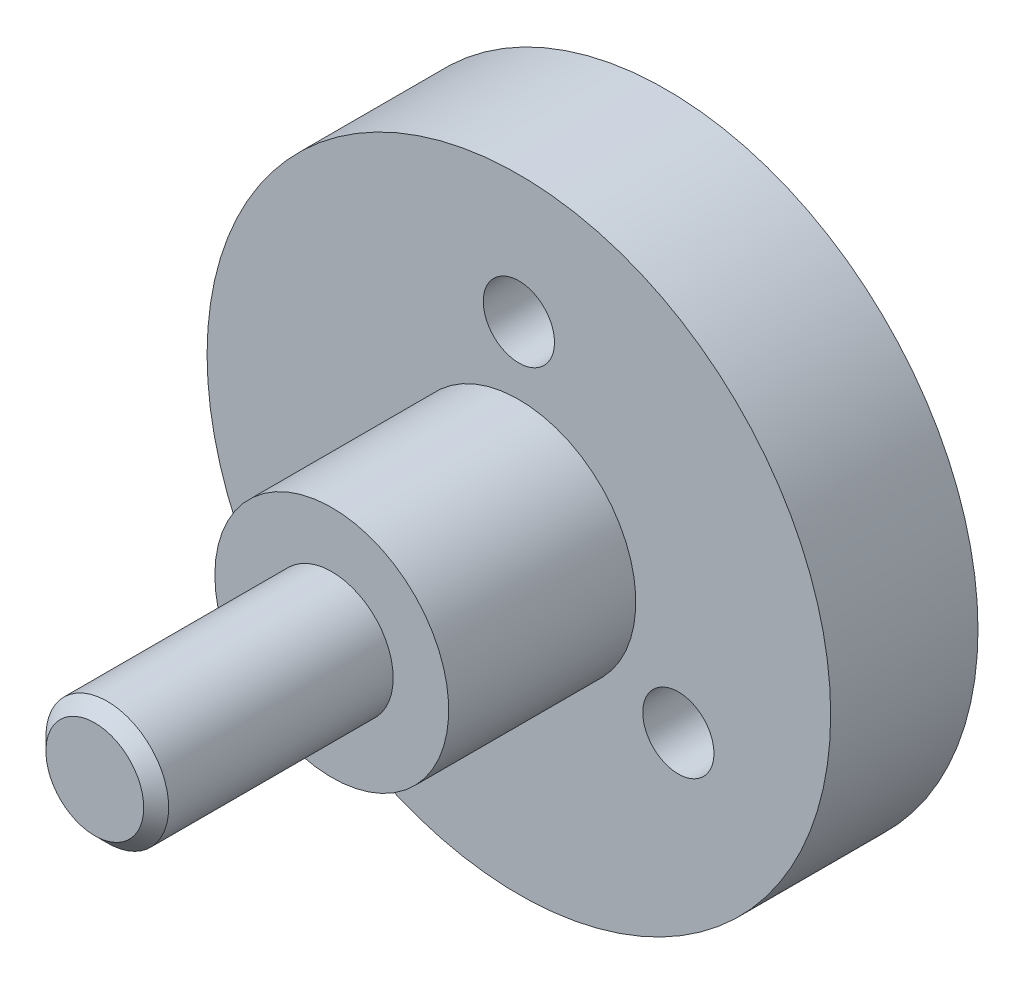
ISO-10303-21;
HEADER;
FILE_DESCRIPTION(('STEP AP214'),'2;1');
FILE_NAME('part.step','',(''),(''),'','','');
FILE_SCHEMA(('AUTOMOTIVE_DESIGN { 1 0 10303 214 1 1 1 1 }'));
ENDSEC;
DATA;
#1=APPLICATION_CONTEXT('core data for automotive mechanical design processes');
#2=APPLICATION_PROTOCOL_DEFINITION('international standard','automotive_design',2000,#1);
#3=PRODUCT_CONTEXT('',#1,'mechanical');
#4=PRODUCT('Part','Part','',(#3));
#5=PRODUCT_RELATED_PRODUCT_CATEGORY('part','',(#4));
#6=PRODUCT_DEFINITION_FORMATION('','',#4);
#7=PRODUCT_DEFINITION_CONTEXT('part definition',#1,'design');
#8=PRODUCT_DEFINITION('design','',#6,#7);
#9=PRODUCT_DEFINITION_SHAPE('','',#8);
#10=(LENGTH_UNIT() NAMED_UNIT(*) SI_UNIT(.MILLI.,.METRE.));
#11=(NAMED_UNIT(*) PLANE_ANGLE_UNIT() SI_UNIT($,.RADIAN.));
#12=(NAMED_UNIT(*) SI_UNIT($,.STERADIAN.) SOLID_ANGLE_UNIT());
#13=UNCERTAINTY_MEASURE_WITH_UNIT(LENGTH_MEASURE(1.E-05),#10,'distance_accuracy_value','');
#14=(GEOMETRIC_REPRESENTATION_CONTEXT(3) GLOBAL_UNCERTAINTY_ASSIGNED_CONTEXT((#13)) GLOBAL_UNIT_ASSIGNED_CONTEXT((#10,
#11,#12)) REPRESENTATION_CONTEXT('',''));
#15=CARTESIAN_POINT('',(0.,0.,0.));
#16=DIRECTION('',(0.,0.,1.));
#17=DIRECTION('',(1.,0.,0.));
#18=AXIS2_PLACEMENT_3D('',#15,#16,#17);
#19=CARTESIAN_POINT('',(0.,0.,2.54));
#20=DIRECTION('',(0.,0.,-1.));
#21=DIRECTION('',(-1.,0.,0.));
#22=AXIS2_PLACEMENT_3D('',#19,#20,#21);
#23=CYLINDRICAL_SURFACE('',#22,6.35);
#24=CARTESIAN_POINT('',(0.,0.,2.54));
#25=DIRECTION('',(0.,0.,-1.));
#26=DIRECTION('',(-1.,0.,0.));
#27=AXIS2_PLACEMENT_3D('',#24,#25,#26);
#28=CIRCLE('',#27,6.35);
#29=CARTESIAN_POINT('',(-5.859720286426,-2.44666674576814,2.54));
#30=VERTEX_POINT('',#29);
#31=CARTESIAN_POINT('',(-0.810984586783252,6.298,2.54));
#32=VERTEX_POINT('',#31);
#33=EDGE_CURVE('E100',#30,#32,#28,.T.);
#34=ORIENTED_EDGE('',*,*,#33,.F.);
#35=DIRECTION('',(0.,0.,1.));
#36=VECTOR('',#35,1.);
#37=CARTESIAN_POINT('',(-5.859720286426,-2.44666674576814,3.));
#38=LINE('',#37,#36);
#39=CARTESIAN_POINT('',(-5.859720286426,-2.44666674576814,0.));
#40=VERTEX_POINT('',#39);
#41=EDGE_CURVE('E49',#30,#40,#38,.F.);
#42=ORIENTED_EDGE('',*,*,#41,.T.);
#43=CARTESIAN_POINT('',(0.,0.,0.));
#44=DIRECTION('',(0.,0.,-1.));
#45=DIRECTION('',(-1.,0.,0.));
#46=AXIS2_PLACEMENT_3D('',#43,#44,#45);
#47=CIRCLE('',#46,6.35);
#48=CARTESIAN_POINT('',(-0.810984586783251,6.298,0.));
#49=VERTEX_POINT('',#48);
#50=EDGE_CURVE('E98',#40,#49,#47,.T.);
#51=ORIENTED_EDGE('',*,*,#50,.T.);
#52=DIRECTION('',(0.,0.,1.));
#53=VECTOR('',#52,1.);
#54=CARTESIAN_POINT('',(-0.810984586783251,6.298,3.));
#55=LINE('',#54,#53);
#56=EDGE_CURVE('E113',#49,#32,#55,.T.);
#57=ORIENTED_EDGE('',*,*,#56,.T.);
#58=EDGE_LOOP('',(#34,#42,#51,#57));
#59=FACE_BOUND('',#58,.T.);
#60=ADVANCED_FACE('F33',(#59),#23,.F.);
#61=CARTESIAN_POINT('',(5.04873569964323,-3.85133325423132,0.));
#62=VERTEX_POINT('',#61);
#63=CARTESIAN_POINT('',(-5.04873569964231,-3.85133325423252,0.));
#64=VERTEX_POINT('',#63);
#65=EDGE_CURVE('E108',#62,#64,#47,.T.);
#66=ORIENTED_EDGE('',*,*,#65,.T.);
#67=DIRECTION('',(0.,0.,1.));
#68=VECTOR('',#67,1.);
#69=CARTESIAN_POINT('',(-5.04873569964231,-3.85133325423252,3.));
#70=LINE('',#69,#68);
#71=CARTESIAN_POINT('',(-5.04873569964231,-3.85133325423252,2.54));
#72=VERTEX_POINT('',#71);
#73=EDGE_CURVE('E88',#64,#72,#70,.T.);
#74=ORIENTED_EDGE('',*,*,#73,.T.);
#75=CARTESIAN_POINT('',(5.04873569964322,-3.85133325423132,2.54));
#76=VERTEX_POINT('',#75);
#77=EDGE_CURVE('E120',#76,#72,#28,.T.);
#78=ORIENTED_EDGE('',*,*,#77,.F.);
#79=DIRECTION('',(0.,0.,1.));
#80=VECTOR('',#79,1.);
#81=CARTESIAN_POINT('',(5.04873569964323,-3.85133325423132,3.));
#82=LINE('',#81,#80);
#83=EDGE_CURVE('E57',#76,#62,#82,.F.);
#84=ORIENTED_EDGE('',*,*,#83,.T.);
#85=EDGE_LOOP('',(#66,#74,#78,#84));
#86=FACE_BOUND('',#85,.T.);
#87=ADVANCED_FACE('F160',(#86),#23,.F.);
#88=CARTESIAN_POINT('',(0.,0.,6.));
#89=DIRECTION('',(0.,0.,-1.));
#90=DIRECTION('',(-1.,0.,0.));
#91=AXIS2_PLACEMENT_3D('',#88,#89,#90);
#92=CYLINDRICAL_SURFACE('',#91,12.7);
#93=CARTESIAN_POINT('',(0.,0.,6.));
#94=DIRECTION('',(0.,0.,1.));
#95=DIRECTION('',(1.,0.,0.));
#96=AXIS2_PLACEMENT_3D('',#93,#94,#95);
#97=CIRCLE('',#96,12.7);
#98=CARTESIAN_POINT('',(12.7,0.,6.));
#99=VERTEX_POINT('',#98);
#100=EDGE_CURVE('E130',#99,#99,#97,.T.);
#101=ORIENTED_EDGE('',*,*,#100,.F.);
#102=EDGE_LOOP('',(#101));
#103=FACE_BOUND('',#102,.T.);
#104=CARTESIAN_POINT('',(0.,0.,0.));
#105=DIRECTION('',(0.,0.,1.));
#106=DIRECTION('',(1.,0.,0.));
#107=AXIS2_PLACEMENT_3D('',#104,#105,#106);
#108=CIRCLE('',#107,12.7);
#109=CARTESIAN_POINT('',(12.7,0.,0.));
#110=VERTEX_POINT('',#109);
#111=EDGE_CURVE('E127',#110,#110,#108,.T.);
#112=ORIENTED_EDGE('',*,*,#111,.T.);
#113=EDGE_LOOP('',(#112));
#114=FACE_BOUND('',#113,.T.);
#115=ADVANCED_FACE('F166',(#103,#114),#92,.T.);
#116=CARTESIAN_POINT('',(0.,0.,6.));
#117=DIRECTION('',(0.,0.,1.));
#118=DIRECTION('',(1.,0.,0.));
#119=AXIS2_PLACEMENT_3D('',#116,#117,#118);
#120=PLANE('',#119);
#121=CARTESIAN_POINT('',(0.,0.,6.));
#122=DIRECTION('',(0.,0.,1.));
#123=DIRECTION('',(1.,0.,0.));
#124=AXIS2_PLACEMENT_3D('',#121,#122,#123);
#125=CIRCLE('',#124,4.7625);
#126=CARTESIAN_POINT('',(-4.7625,0.,6.));
#127=VERTEX_POINT('',#126);
#128=EDGE_CURVE('E303',#127,#127,#125,.T.);
#129=ORIENTED_EDGE('',*,*,#128,.F.);
#130=EDGE_LOOP('',(#129));
#131=FACE_BOUND('',#130,.T.);
#132=CARTESIAN_POINT('',(-6.49519052838281,-3.75000000000028,6.));
#133=DIRECTION('',(0.,0.,1.));
#134=DIRECTION('',(1.,0.,0.));
#135=AXIS2_PLACEMENT_3D('',#132,#133,#134);
#136=CIRCLE('',#135,1.45);
#137=CARTESIAN_POINT('',(-5.04519052838281,-3.75000000000028,6.));
#138=VERTEX_POINT('',#137);
#139=EDGE_CURVE('E93',#138,#138,#136,.T.);
#140=ORIENTED_EDGE('',*,*,#139,.F.);
#141=EDGE_LOOP('',(#140));
#142=FACE_BOUND('',#141,.T.);
#143=CARTESIAN_POINT('',(6.49519052838377,-3.74999999999972,6.));
#144=DIRECTION('',(0.,0.,1.));
#145=DIRECTION('',(1.,0.,0.));
#146=AXIS2_PLACEMENT_3D('',#143,#144,#145);
#147=CIRCLE('',#146,1.45);
#148=CARTESIAN_POINT('',(7.94519052838377,-3.74999999999972,6.));
#149=VERTEX_POINT('',#148);
#150=EDGE_CURVE('E101',#149,#149,#147,.T.);
#151=ORIENTED_EDGE('',*,*,#150,.F.);
#152=EDGE_LOOP('',(#151));
#153=FACE_BOUND('',#152,.T.);
#154=CARTESIAN_POINT('',(0.,7.5,6.));
#155=DIRECTION('',(0.,0.,1.));
#156=DIRECTION('',(1.,0.,0.));
#157=AXIS2_PLACEMENT_3D('',#154,#155,#156);
#158=CIRCLE('',#157,1.45);
#159=CARTESIAN_POINT('',(1.45,7.5,6.));
#160=VERTEX_POINT('',#159);
#161=EDGE_CURVE('E287',#160,#160,#158,.T.);
#162=ORIENTED_EDGE('',*,*,#161,.F.);
#163=EDGE_LOOP('',(#162));
#164=FACE_BOUND('',#163,.T.);
#165=ORIENTED_EDGE('',*,*,#100,.T.);
#166=EDGE_LOOP('',(#165));
#167=FACE_BOUND('',#166,.T.);
#168=ADVANCED_FACE('F177',(#131,#142,#153,#164,#167),#120,.T.);
#169=CARTESIAN_POINT('',(0.,0.,0.));
#170=DIRECTION('',(0.,0.,1.));
#171=DIRECTION('',(1.,0.,0.));
#172=AXIS2_PLACEMENT_3D('',#169,#170,#171);
#173=PLANE('',#172);
#174=ORIENTED_EDGE('',*,*,#50,.F.);
#175=CARTESIAN_POINT('',(-6.49519052838281,-3.75000000000028,0.));
#176=DIRECTION('',(0.,0.,1.));
#177=DIRECTION('',(1.,0.,0.));
#178=AXIS2_PLACEMENT_3D('',#175,#176,#177);
#179=CIRCLE('',#178,1.45);
#180=EDGE_CURVE('E85',#40,#64,#179,.T.);
#181=ORIENTED_EDGE('',*,*,#180,.T.);
#182=ORIENTED_EDGE('',*,*,#65,.F.);
#183=CARTESIAN_POINT('',(6.49519052838377,-3.74999999999972,0.));
#184=DIRECTION('',(0.,0.,1.));
#185=DIRECTION('',(1.,0.,0.));
#186=AXIS2_PLACEMENT_3D('',#183,#184,#185);
#187=CIRCLE('',#186,1.45);
#188=CARTESIAN_POINT('',(5.85972028642604,-2.44666674576802,0.));
#189=VERTEX_POINT('',#188);
#190=EDGE_CURVE('E295',#62,#189,#187,.T.);
#191=ORIENTED_EDGE('',*,*,#190,.T.);
#192=CARTESIAN_POINT('',(0.810984586783251,6.298,0.));
#193=VERTEX_POINT('',#192);
#194=EDGE_CURVE('E111',#193,#189,#47,.T.);
#195=ORIENTED_EDGE('',*,*,#194,.F.);
#196=CARTESIAN_POINT('',(0.,7.5,0.));
#197=DIRECTION('',(0.,0.,1.));
#198=DIRECTION('',(1.,0.,0.));
#199=AXIS2_PLACEMENT_3D('',#196,#197,#198);
#200=CIRCLE('',#199,1.45);
#201=EDGE_CURVE('E107',#193,#49,#200,.T.);
#202=ORIENTED_EDGE('',*,*,#201,.T.);
#203=EDGE_LOOP('',(#174,#181,#182,#191,#195,#202));
#204=FACE_BOUND('',#203,.T.);
#205=ORIENTED_EDGE('',*,*,#111,.F.);
#206=EDGE_LOOP('',(#205));
#207=FACE_BOUND('',#206,.T.);
#208=ADVANCED_FACE('F104',(#204,#207),#173,.F.);
#209=ORIENTED_EDGE('',*,*,#194,.T.);
#210=DIRECTION('',(0.,0.,1.));
#211=VECTOR('',#210,1.);
#212=CARTESIAN_POINT('',(5.85972028642604,-2.44666674576802,3.));
#213=LINE('',#212,#211);
#214=CARTESIAN_POINT('',(5.85972028642604,-2.44666674576802,2.54));
#215=VERTEX_POINT('',#214);
#216=EDGE_CURVE('E293',#189,#215,#213,.T.);
#217=ORIENTED_EDGE('',*,*,#216,.T.);
#218=CARTESIAN_POINT('',(0.810984586783252,6.298,2.54));
#219=VERTEX_POINT('',#218);
#220=EDGE_CURVE('E121',#219,#215,#28,.T.);
#221=ORIENTED_EDGE('',*,*,#220,.F.);
#222=DIRECTION('',(0.,0.,1.));
#223=VECTOR('',#222,1.);
#224=CARTESIAN_POINT('',(0.810984586783251,6.298,3.));
#225=LINE('',#224,#223);
#226=EDGE_CURVE('E109',#219,#193,#225,.F.);
#227=ORIENTED_EDGE('',*,*,#226,.T.);
#228=EDGE_LOOP('',(#209,#217,#221,#227));
#229=FACE_BOUND('',#228,.T.);
#230=ADVANCED_FACE('F162',(#229),#23,.F.);
#231=CARTESIAN_POINT('',(0.,0.,2.54));
#232=DIRECTION('',(0.,0.,-1.));
#233=DIRECTION('',(-1.,0.,0.));
#234=AXIS2_PLACEMENT_3D('',#231,#232,#233);
#235=PLANE('',#234);
#236=CARTESIAN_POINT('',(-6.49519052838281,-3.75000000000028,2.54));
#237=DIRECTION('',(0.,0.,-1.));
#238=DIRECTION('',(-1.,0.,0.));
#239=AXIS2_PLACEMENT_3D('',#236,#237,#238);
#240=CIRCLE('',#239,1.45);
#241=EDGE_CURVE('E140',#30,#72,#240,.T.);
#242=ORIENTED_EDGE('',*,*,#241,.F.);
#243=ORIENTED_EDGE('',*,*,#33,.T.);
#244=CARTESIAN_POINT('',(0.,7.5,2.54));
#245=DIRECTION('',(0.,0.,-1.));
#246=DIRECTION('',(-1.,0.,0.));
#247=AXIS2_PLACEMENT_3D('',#244,#245,#246);
#248=CIRCLE('',#247,1.45);
#249=EDGE_CURVE('E135',#219,#32,#248,.T.);
#250=ORIENTED_EDGE('',*,*,#249,.F.);
#251=ORIENTED_EDGE('',*,*,#220,.T.);
#252=CARTESIAN_POINT('',(6.49519052838377,-3.74999999999972,2.54));
#253=DIRECTION('',(0.,0.,-1.));
#254=DIRECTION('',(-1.,0.,0.));
#255=AXIS2_PLACEMENT_3D('',#252,#253,#254);
#256=CIRCLE('',#255,1.45);
#257=EDGE_CURVE('E138',#76,#215,#256,.T.);
#258=ORIENTED_EDGE('',*,*,#257,.F.);
#259=ORIENTED_EDGE('',*,*,#77,.T.);
#260=EDGE_LOOP('',(#242,#243,#250,#251,#258,#259));
#261=FACE_BOUND('',#260,.T.);
#262=ADVANCED_FACE('F171',(#261),#235,.T.);
#263=CARTESIAN_POINT('',(0.,7.5,0.));
#264=DIRECTION('',(0.,0.,1.));
#265=DIRECTION('',(1.,0.,0.));
#266=AXIS2_PLACEMENT_3D('',#263,#264,#265);
#267=CYLINDRICAL_SURFACE('',#266,1.45);
#268=ORIENTED_EDGE('',*,*,#161,.T.);
#269=EDGE_LOOP('',(#268));
#270=FACE_BOUND('',#269,.T.);
#271=ORIENTED_EDGE('',*,*,#249,.T.);
#272=ORIENTED_EDGE('',*,*,#56,.F.);
#273=ORIENTED_EDGE('',*,*,#201,.F.);
#274=ORIENTED_EDGE('',*,*,#226,.F.);
#275=EDGE_LOOP('',(#271,#272,#273,#274));
#276=FACE_BOUND('',#275,.T.);
#277=ADVANCED_FACE('F176',(#270,#276),#267,.F.);
#278=CARTESIAN_POINT('',(6.49519052838377,-3.74999999999972,0.));
#279=DIRECTION('',(0.,0.,1.));
#280=DIRECTION('',(1.,0.,0.));
#281=AXIS2_PLACEMENT_3D('',#278,#279,#280);
#282=CYLINDRICAL_SURFACE('',#281,1.45);
#283=ORIENTED_EDGE('',*,*,#150,.T.);
#284=EDGE_LOOP('',(#283));
#285=FACE_BOUND('',#284,.T.);
#286=ORIENTED_EDGE('',*,*,#257,.T.);
#287=ORIENTED_EDGE('',*,*,#216,.F.);
#288=ORIENTED_EDGE('',*,*,#190,.F.);
#289=ORIENTED_EDGE('',*,*,#83,.F.);
#290=EDGE_LOOP('',(#286,#287,#288,#289));
#291=FACE_BOUND('',#290,.T.);
#292=ADVANCED_FACE('F243',(#285,#291),#282,.F.);
#293=CARTESIAN_POINT('',(-6.49519052838281,-3.75000000000028,0.));
#294=DIRECTION('',(0.,0.,1.));
#295=DIRECTION('',(1.,0.,0.));
#296=AXIS2_PLACEMENT_3D('',#293,#294,#295);
#297=CYLINDRICAL_SURFACE('',#296,1.45);
#298=ORIENTED_EDGE('',*,*,#139,.T.);
#299=EDGE_LOOP('',(#298));
#300=FACE_BOUND('',#299,.T.);
#301=ORIENTED_EDGE('',*,*,#241,.T.);
#302=ORIENTED_EDGE('',*,*,#73,.F.);
#303=ORIENTED_EDGE('',*,*,#180,.F.);
#304=ORIENTED_EDGE('',*,*,#41,.F.);
#305=EDGE_LOOP('',(#301,#302,#303,#304));
#306=FACE_BOUND('',#305,.T.);
#307=ADVANCED_FACE('F86',(#300,#306),#297,.F.);
#308=CARTESIAN_POINT('',(0.,0.,13.62));
#309=DIRECTION('',(0.,0.,-1.));
#310=DIRECTION('',(-1.,0.,0.));
#311=AXIS2_PLACEMENT_3D('',#308,#309,#310);
#312=CYLINDRICAL_SURFACE('',#311,4.7625);
#313=CARTESIAN_POINT('',(0.,0.,13.62));
#314=DIRECTION('',(0.,0.,1.));
#315=DIRECTION('',(1.,0.,0.));
#316=AXIS2_PLACEMENT_3D('',#313,#314,#315);
#317=CIRCLE('',#316,4.7625);
#318=CARTESIAN_POINT('',(-4.7625,0.,13.62));
#319=VERTEX_POINT('',#318);
#320=EDGE_CURVE('E306',#319,#319,#317,.T.);
#321=CARTESIAN_POINT('',(-4.7625,0.,13.62));
#322=CARTESIAN_POINT('',(-4.7625,0.,13.540625));
#323=CARTESIAN_POINT('',(-4.7625,0.,13.46125));
#324=CARTESIAN_POINT('',(-4.7625,0.,13.3025));
#325=CARTESIAN_POINT('',(-4.7625,0.,13.223125));
#326=CARTESIAN_POINT('',(-4.7625,0.,13.064375));
#327=CARTESIAN_POINT('',(-4.7625,0.,12.985));
#328=CARTESIAN_POINT('',(-4.7625,0.,12.82625));
#329=CARTESIAN_POINT('',(-4.7625,0.,12.746875));
#330=CARTESIAN_POINT('',(-4.7625,0.,12.588125));
#331=CARTESIAN_POINT('',(-4.7625,0.,12.50875));
#332=CARTESIAN_POINT('',(-4.7625,0.,12.35));
#333=CARTESIAN_POINT('',(-4.7625,0.,12.270625));
#334=CARTESIAN_POINT('',(-4.7625,0.,12.111875));
#335=CARTESIAN_POINT('',(-4.7625,0.,12.0325));
#336=CARTESIAN_POINT('',(-4.7625,0.,11.87375));
#337=CARTESIAN_POINT('',(-4.7625,0.,11.794375));
#338=CARTESIAN_POINT('',(-4.7625,0.,11.635625));
#339=CARTESIAN_POINT('',(-4.7625,0.,11.55625));
#340=CARTESIAN_POINT('',(-4.7625,0.,11.3975));
#341=CARTESIAN_POINT('',(-4.7625,0.,11.318125));
#342=CARTESIAN_POINT('',(-4.7625,0.,11.159375));
#343=CARTESIAN_POINT('',(-4.7625,0.,11.08));
#344=CARTESIAN_POINT('',(-4.7625,0.,10.92125));
#345=CARTESIAN_POINT('',(-4.7625,0.,10.841875));
#346=CARTESIAN_POINT('',(-4.7625,0.,10.683125));
#347=CARTESIAN_POINT('',(-4.7625,0.,10.60375));
#348=CARTESIAN_POINT('',(-4.7625,0.,10.445));
#349=CARTESIAN_POINT('',(-4.7625,0.,10.365625));
#350=CARTESIAN_POINT('',(-4.7625,0.,10.206875));
#351=CARTESIAN_POINT('',(-4.7625,0.,10.1275));
#352=CARTESIAN_POINT('',(-4.7625,0.,9.96875));
#353=CARTESIAN_POINT('',(-4.7625,0.,9.889375));
#354=CARTESIAN_POINT('',(-4.7625,0.,9.730625));
#355=CARTESIAN_POINT('',(-4.7625,0.,9.65125));
#356=CARTESIAN_POINT('',(-4.7625,0.,9.4925));
#357=CARTESIAN_POINT('',(-4.7625,0.,9.413125));
#358=CARTESIAN_POINT('',(-4.7625,0.,9.254375));
#359=CARTESIAN_POINT('',(-4.7625,0.,9.175));
#360=CARTESIAN_POINT('',(-4.7625,0.,9.01625));
#361=CARTESIAN_POINT('',(-4.7625,0.,8.936875));
#362=CARTESIAN_POINT('',(-4.7625,0.,8.778125));
#363=CARTESIAN_POINT('',(-4.7625,0.,8.69875));
#364=CARTESIAN_POINT('',(-4.7625,0.,8.54));
#365=CARTESIAN_POINT('',(-4.7625,0.,8.460625));
#366=CARTESIAN_POINT('',(-4.7625,0.,8.301875));
#367=CARTESIAN_POINT('',(-4.7625,0.,8.2225));
#368=CARTESIAN_POINT('',(-4.7625,0.,8.06375));
#369=CARTESIAN_POINT('',(-4.7625,0.,7.984375));
#370=CARTESIAN_POINT('',(-4.7625,0.,7.825625));
#371=CARTESIAN_POINT('',(-4.7625,0.,7.74625));
#372=CARTESIAN_POINT('',(-4.7625,0.,7.5875));
#373=CARTESIAN_POINT('',(-4.7625,0.,7.508125));
#374=CARTESIAN_POINT('',(-4.7625,0.,7.349375));
#375=CARTESIAN_POINT('',(-4.7625,0.,7.27));
#376=CARTESIAN_POINT('',(-4.7625,0.,7.11125));
#377=CARTESIAN_POINT('',(-4.7625,0.,7.031875));
#378=CARTESIAN_POINT('',(-4.7625,0.,6.873125));
#379=CARTESIAN_POINT('',(-4.7625,0.,6.79375));
#380=CARTESIAN_POINT('',(-4.7625,0.,6.635));
#381=CARTESIAN_POINT('',(-4.7625,0.,6.555625));
#382=CARTESIAN_POINT('',(-4.7625,0.,6.396875));
#383=CARTESIAN_POINT('',(-4.7625,0.,6.3175));
#384=CARTESIAN_POINT('',(-4.7625,0.,6.15875));
#385=CARTESIAN_POINT('',(-4.7625,0.,6.079375));
#386=CARTESIAN_POINT('',(-4.7625,0.,6.));
#387=B_SPLINE_CURVE_WITH_KNOTS('',3,(#321,#322,#323,#324,#325,#326,#327,#328,#329,#330,#331,
#332,#333,#334,#335,#336,#337,#338,#339,#340,#341,#342,#343,#344,#345,#346,#347,#348,#349,#350,
#351,#352,#353,#354,#355,#356,#357,#358,#359,#360,#361,#362,#363,#364,#365,#366,#367,#368,#369,
#370,#371,#372,#373,#374,#375,#376,#377,#378,#379,#380,#381,#382,#383,#384,#385,#386),
.UNSPECIFIED.,.F.,.F.,(4,2,2,2,2,2,2,2,2,2,2,2,2,2,2,2,2,2,2,2,2,2,2,2,2,2,2,2,2,2,2,2,4),(0.,
0.238124999999999,0.476249999999999,0.714375,0.952499999999998,1.190625,1.42875,1.666875,1.905,
2.143125,2.38125,2.619375,2.8575,3.095625,3.33375,3.571875,3.81,4.048125,4.28625,4.524375,
4.7625,5.000625,5.23875,5.476875,5.715,5.953125,6.19125,6.429375,6.6675,6.905625,7.14375,
7.381875,7.62),.UNSPECIFIED.);
#388=EDGE_CURVE('BSEAM204',#319,#127,#387,.T.);
#389=ORIENTED_EDGE('',*,*,#320,.F.);
#390=ORIENTED_EDGE('',*,*,#128,.T.);
#391=ORIENTED_EDGE('',*,*,#388,.T.);
#392=ORIENTED_EDGE('',*,*,#388,.F.);
#393=EDGE_LOOP('',(#389,#391,#390,#392));
#394=FACE_BOUND('',#393,.T.);
#395=ADVANCED_FACE('F204',(#394),#312,.T.);
#396=CARTESIAN_POINT('',(0.,0.,13.62));
#397=DIRECTION('',(0.,0.,1.));
#398=DIRECTION('',(1.,0.,0.));
#399=AXIS2_PLACEMENT_3D('',#396,#397,#398);
#400=PLANE('',#399);
#401=CARTESIAN_POINT('',(0.,0.,13.62));
#402=DIRECTION('',(0.,0.,1.));
#403=DIRECTION('',(1.,0.,0.));
#404=AXIS2_PLACEMENT_3D('',#401,#402,#403);
#405=CIRCLE('',#404,2.5);
#406=CARTESIAN_POINT('',(2.5,0.,13.62));
#407=VERTEX_POINT('',#406);
#408=EDGE_CURVE('E37',#407,#407,#405,.T.);
#409=ORIENTED_EDGE('',*,*,#408,.F.);
#410=EDGE_LOOP('',(#409));
#411=FACE_BOUND('',#410,.T.);
#412=ORIENTED_EDGE('',*,*,#320,.T.);
#413=EDGE_LOOP('',(#412));
#414=FACE_BOUND('',#413,.T.);
#415=ADVANCED_FACE('F156',(#411,#414),#400,.T.);
#416=CARTESIAN_POINT('',(0.,0.,23.272));
#417=DIRECTION('',(0.,0.,1.));
#418=DIRECTION('',(1.,0.,0.));
#419=AXIS2_PLACEMENT_3D('',#416,#417,#418);
#420=PLANE('',#419);
#421=CARTESIAN_POINT('',(0.,0.,23.272));
#422=DIRECTION('',(0.,0.,1.));
#423=DIRECTION('',(1.,0.,0.));
#424=AXIS2_PLACEMENT_3D('',#421,#422,#423);
#425=CIRCLE('',#424,1.99200000000001);
#426=CARTESIAN_POINT('',(1.99200000000001,0.,23.272));
#427=VERTEX_POINT('',#426);
#428=EDGE_CURVE('E42',#427,#427,#425,.T.);
#429=ORIENTED_EDGE('',*,*,#428,.T.);
#430=EDGE_LOOP('',(#429));
#431=FACE_BOUND('',#430,.T.);
#432=ADVANCED_FACE('F145',(#431),#420,.T.);
#433=CARTESIAN_POINT('',(0.,0.,23.272));
#434=DIRECTION('',(0.,0.,-1.));
#435=DIRECTION('',(-1.,0.,0.));
#436=AXIS2_PLACEMENT_3D('',#433,#434,#435);
#437=CONICAL_SURFACE('',#436,1.99200000000001,0.785398163397443);
#438=CARTESIAN_POINT('',(0.,0.,22.764));
#439=DIRECTION('',(0.,0.,1.));
#440=DIRECTION('',(1.,0.,0.));
#441=AXIS2_PLACEMENT_3D('',#438,#439,#440);
#442=CIRCLE('',#441,2.5);
#443=CARTESIAN_POINT('',(2.5,0.,22.764));
#444=VERTEX_POINT('',#443);
#445=EDGE_CURVE('E11',#444,#444,#442,.F.);
#446=ORIENTED_EDGE('',*,*,#445,.F.);
#447=EDGE_LOOP('',(#446));
#448=FACE_BOUND('',#447,.T.);
#449=ORIENTED_EDGE('',*,*,#428,.F.);
#450=EDGE_LOOP('',(#449));
#451=FACE_BOUND('',#450,.T.);
#452=ADVANCED_FACE('F35',(#448,#451),#437,.T.);
#453=CARTESIAN_POINT('',(0.,0.,23.272));
#454=DIRECTION('',(0.,0.,-1.));
#455=DIRECTION('',(-1.,0.,0.));
#456=AXIS2_PLACEMENT_3D('',#453,#454,#455);
#457=CYLINDRICAL_SURFACE('',#456,2.5);
#458=ORIENTED_EDGE('',*,*,#408,.T.);
#459=EDGE_LOOP('',(#458));
#460=FACE_BOUND('',#459,.T.);
#461=ORIENTED_EDGE('',*,*,#445,.T.);
#462=EDGE_LOOP('',(#461));
#463=FACE_BOUND('',#462,.T.);
#464=ADVANCED_FACE('F148',(#460,#463),#457,.T.);
#465=CLOSED_SHELL('',(#60,#87,#115,#168,#208,#230,#262,#277,#292,#307,#395,#415,#432,#452,#464));
#466=MANIFOLD_SOLID_BREP('B2',#465);
#467=ADVANCED_BREP_SHAPE_REPRESENTATION('',(#18,#466),#14);
#468=SHAPE_DEFINITION_REPRESENTATION(#9,#467);
ENDSEC;
END-ISO-10303-21;
